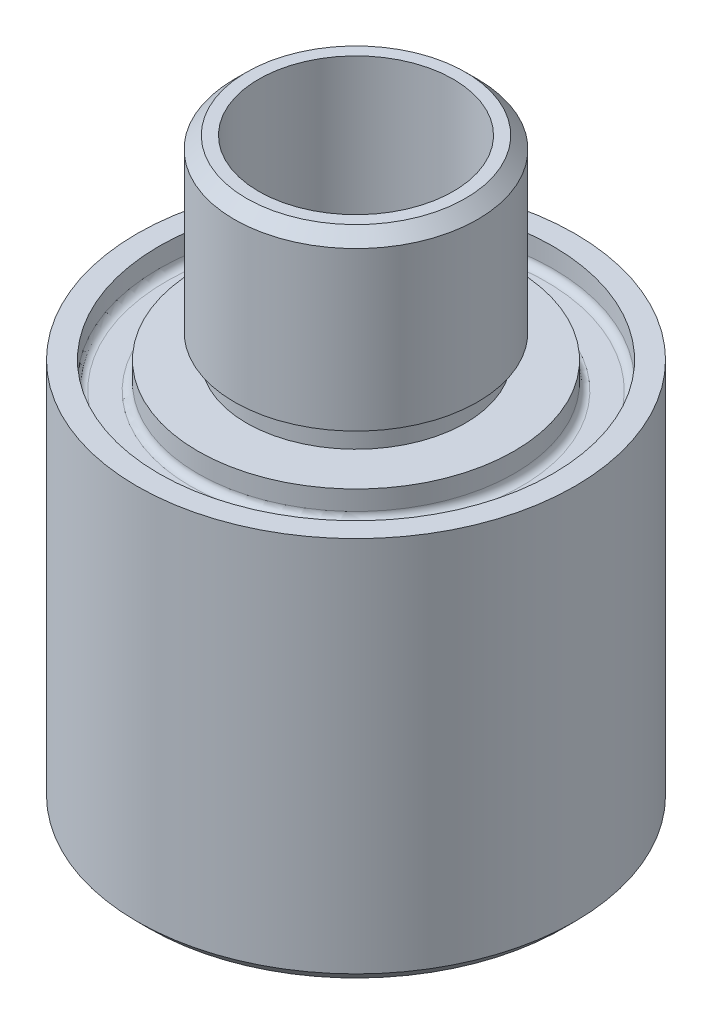
ISO-10303-21;
HEADER;
FILE_DESCRIPTION(('STEP AP214'),'2;1');
FILE_NAME('part.step','',(''),(''),'','','');
FILE_SCHEMA(('AUTOMOTIVE_DESIGN { 1 0 10303 214 1 1 1 1 }'));
ENDSEC;
DATA;
#1=APPLICATION_CONTEXT('core data for automotive mechanical design processes');
#2=APPLICATION_PROTOCOL_DEFINITION('international standard','automotive_design',2000,#1);
#3=PRODUCT_CONTEXT('',#1,'mechanical');
#4=PRODUCT('Part','Part','',(#3));
#5=PRODUCT_RELATED_PRODUCT_CATEGORY('part','',(#4));
#6=PRODUCT_DEFINITION_FORMATION('','',#4);
#7=PRODUCT_DEFINITION_CONTEXT('part definition',#1,'design');
#8=PRODUCT_DEFINITION('design','',#6,#7);
#9=PRODUCT_DEFINITION_SHAPE('','',#8);
#10=(LENGTH_UNIT() NAMED_UNIT(*) SI_UNIT(.MILLI.,.METRE.));
#11=(NAMED_UNIT(*) PLANE_ANGLE_UNIT() SI_UNIT($,.RADIAN.));
#12=(NAMED_UNIT(*) SI_UNIT($,.STERADIAN.) SOLID_ANGLE_UNIT());
#13=UNCERTAINTY_MEASURE_WITH_UNIT(LENGTH_MEASURE(1.E-05),#10,'distance_accuracy_value','');
#14=(GEOMETRIC_REPRESENTATION_CONTEXT(3) GLOBAL_UNCERTAINTY_ASSIGNED_CONTEXT((#13)) GLOBAL_UNIT_ASSIGNED_CONTEXT((#10,
#11,#12)) REPRESENTATION_CONTEXT('',''));
#15=CARTESIAN_POINT('',(0.,0.,0.));
#16=DIRECTION('',(0.,0.,1.));
#17=DIRECTION('',(1.,0.,0.));
#18=AXIS2_PLACEMENT_3D('',#15,#16,#17);
#19=CARTESIAN_POINT('',(0.,16.,0.));
#20=DIRECTION('',(0.,-1.,0.));
#21=DIRECTION('',(0.,0.,-1.));
#22=AXIS2_PLACEMENT_3D('',#19,#20,#21);
#23=CYLINDRICAL_SURFACE('',#22,9.);
#24=CARTESIAN_POINT('',(0.,0.500000000000002,0.));
#25=DIRECTION('',(0.,1.,0.));
#26=DIRECTION('',(0.,0.,1.));
#27=AXIS2_PLACEMENT_3D('',#24,#25,#26);
#28=CIRCLE('',#27,9.);
#29=CARTESIAN_POINT('',(0.,0.500000000000002,9.));
#30=VERTEX_POINT('',#29);
#31=EDGE_CURVE('E49',#30,#30,#28,.T.);
#32=ORIENTED_EDGE('',*,*,#31,.T.);
#33=EDGE_LOOP('',(#32));
#34=FACE_BOUND('',#33,.T.);
#35=CARTESIAN_POINT('',(0.,16.,0.));
#36=DIRECTION('',(0.,1.,0.));
#37=DIRECTION('',(0.,0.,1.));
#38=AXIS2_PLACEMENT_3D('',#35,#36,#37);
#39=CIRCLE('',#38,9.);
#40=CARTESIAN_POINT('',(0.,16.,9.));
#41=VERTEX_POINT('',#40);
#42=EDGE_CURVE('E81',#41,#41,#39,.T.);
#43=ORIENTED_EDGE('',*,*,#42,.F.);
#44=EDGE_LOOP('',(#43));
#45=FACE_BOUND('',#44,.T.);
#46=ADVANCED_FACE('F41',(#34,#45),#23,.T.);
#47=CARTESIAN_POINT('',(0.,16.,0.));
#48=DIRECTION('',(0.,1.,0.));
#49=DIRECTION('',(0.,0.,1.));
#50=AXIS2_PLACEMENT_3D('',#47,#48,#49);
#51=PLANE('',#50);
#52=CARTESIAN_POINT('',(0.,16.,0.));
#53=DIRECTION('',(0.,1.,0.));
#54=DIRECTION('',(0.,0.,1.));
#55=AXIS2_PLACEMENT_3D('',#52,#53,#54);
#56=CIRCLE('',#55,8.1);
#57=CARTESIAN_POINT('',(0.,16.,8.1));
#58=VERTEX_POINT('',#57);
#59=EDGE_CURVE('E98',#58,#58,#56,.T.);
#60=ORIENTED_EDGE('',*,*,#59,.F.);
#61=EDGE_LOOP('',(#60));
#62=FACE_BOUND('',#61,.T.);
#63=ORIENTED_EDGE('',*,*,#42,.T.);
#64=EDGE_LOOP('',(#63));
#65=FACE_BOUND('',#64,.T.);
#66=ADVANCED_FACE('F136',(#62,#65),#51,.T.);
#67=CARTESIAN_POINT('',(0.,0.,0.));
#68=DIRECTION('',(0.,1.,0.));
#69=DIRECTION('',(0.,0.,1.));
#70=AXIS2_PLACEMENT_3D('',#67,#68,#69);
#71=PLANE('',#70);
#72=CARTESIAN_POINT('',(0.,0.,0.));
#73=DIRECTION('',(0.,1.,0.));
#74=DIRECTION('',(0.,0.,1.));
#75=AXIS2_PLACEMENT_3D('',#72,#73,#74);
#76=CIRCLE('',#75,8.49999999999999);
#77=CARTESIAN_POINT('',(0.,0.,8.49999999999999));
#78=VERTEX_POINT('',#77);
#79=EDGE_CURVE('E10',#78,#78,#76,.F.);
#80=ORIENTED_EDGE('',*,*,#79,.T.);
#81=EDGE_LOOP('',(#80));
#82=FACE_BOUND('',#81,.T.);
#83=CARTESIAN_POINT('',(0.,0.,0.));
#84=DIRECTION('',(0.,-1.,0.));
#85=DIRECTION('',(0.,0.,-1.));
#86=AXIS2_PLACEMENT_3D('',#83,#84,#85);
#87=CIRCLE('',#86,7.5);
#88=CARTESIAN_POINT('',(0.,0.,-7.5));
#89=VERTEX_POINT('',#88);
#90=EDGE_CURVE('E85',#89,#89,#87,.T.);
#91=ORIENTED_EDGE('',*,*,#90,.F.);
#92=EDGE_LOOP('',(#91));
#93=FACE_BOUND('',#92,.T.);
#94=ADVANCED_FACE('F146',(#82,#93),#71,.F.);
#95=CARTESIAN_POINT('',(0.,12.5,0.));
#96=DIRECTION('',(0.,-1.,0.));
#97=DIRECTION('',(0.,0.,-1.));
#98=AXIS2_PLACEMENT_3D('',#95,#96,#97);
#99=CYLINDRICAL_SURFACE('',#98,7.5);
#100=CARTESIAN_POINT('',(0.,12.5,0.));
#101=DIRECTION('',(0.,-1.,0.));
#102=DIRECTION('',(0.,0.,-1.));
#103=AXIS2_PLACEMENT_3D('',#100,#101,#102);
#104=CIRCLE('',#103,7.5);
#105=CARTESIAN_POINT('',(0.,12.5,-7.5));
#106=VERTEX_POINT('',#105);
#107=EDGE_CURVE('E84',#106,#106,#104,.T.);
#108=ORIENTED_EDGE('',*,*,#107,.F.);
#109=EDGE_LOOP('',(#108));
#110=FACE_BOUND('',#109,.T.);
#111=ORIENTED_EDGE('',*,*,#90,.T.);
#112=EDGE_LOOP('',(#111));
#113=FACE_BOUND('',#112,.T.);
#114=ADVANCED_FACE('F150',(#110,#113),#99,.F.);
#115=CARTESIAN_POINT('',(0.,12.5,0.));
#116=DIRECTION('',(0.,-1.,0.));
#117=DIRECTION('',(0.,0.,-1.));
#118=AXIS2_PLACEMENT_3D('',#115,#116,#117);
#119=PLANE('',#118);
#120=CARTESIAN_POINT('',(0.,12.5,0.));
#121=DIRECTION('',(0.,-1.,0.));
#122=DIRECTION('',(0.,0.,-1.));
#123=AXIS2_PLACEMENT_3D('',#120,#121,#122);
#124=CIRCLE('',#123,4.5);
#125=CARTESIAN_POINT('',(0.,12.5,-4.5));
#126=VERTEX_POINT('',#125);
#127=EDGE_CURVE('E57',#126,#126,#124,.F.);
#128=ORIENTED_EDGE('',*,*,#127,.T.);
#129=EDGE_LOOP('',(#128));
#130=FACE_BOUND('',#129,.T.);
#131=ORIENTED_EDGE('',*,*,#107,.T.);
#132=EDGE_LOOP('',(#131));
#133=FACE_BOUND('',#132,.T.);
#134=ADVANCED_FACE('F154',(#130,#133),#119,.T.);
#135=CARTESIAN_POINT('',(0.,14.9,0.));
#136=DIRECTION('',(0.,1.,0.));
#137=DIRECTION('',(0.,0.,1.));
#138=AXIS2_PLACEMENT_3D('',#135,#136,#137);
#139=CYLINDRICAL_SURFACE('',#138,8.1);
#140=CARTESIAN_POINT('',(0.,15.2,0.));
#141=DIRECTION('',(0.,1.,0.));
#142=DIRECTION('',(0.,0.,1.));
#143=AXIS2_PLACEMENT_3D('',#140,#141,#142);
#144=CIRCLE('',#143,8.1);
#145=CARTESIAN_POINT('',(0.,15.2,8.1));
#146=VERTEX_POINT('',#145);
#147=EDGE_CURVE('E62',#146,#146,#144,.F.);
#148=ORIENTED_EDGE('',*,*,#147,.T.);
#149=EDGE_LOOP('',(#148));
#150=FACE_BOUND('',#149,.T.);
#151=ORIENTED_EDGE('',*,*,#59,.T.);
#152=EDGE_LOOP('',(#151));
#153=FACE_BOUND('',#152,.T.);
#154=ADVANCED_FACE('F158',(#150,#153),#139,.F.);
#155=CARTESIAN_POINT('',(0.,14.9,0.));
#156=DIRECTION('',(0.,1.,0.));
#157=DIRECTION('',(0.,0.,1.));
#158=AXIS2_PLACEMENT_3D('',#155,#156,#157);
#159=PLANE('',#158);
#160=CARTESIAN_POINT('',(0.,14.9,0.));
#161=DIRECTION('',(0.,1.,0.));
#162=DIRECTION('',(0.,0.,1.));
#163=AXIS2_PLACEMENT_3D('',#160,#161,#162);
#164=CIRCLE('',#163,6.8);
#165=CARTESIAN_POINT('',(0.,14.9,6.8));
#166=VERTEX_POINT('',#165);
#167=EDGE_CURVE('E65',#166,#166,#164,.F.);
#168=ORIENTED_EDGE('',*,*,#167,.T.);
#169=EDGE_LOOP('',(#168));
#170=FACE_BOUND('',#169,.T.);
#171=CARTESIAN_POINT('',(0.,14.9,0.));
#172=DIRECTION('',(0.,1.,0.));
#173=DIRECTION('',(0.,0.,1.));
#174=AXIS2_PLACEMENT_3D('',#171,#172,#173);
#175=CIRCLE('',#174,7.8);
#176=CARTESIAN_POINT('',(0.,14.9,7.8));
#177=VERTEX_POINT('',#176);
#178=EDGE_CURVE('E68',#177,#177,#175,.T.);
#179=ORIENTED_EDGE('',*,*,#178,.T.);
#180=EDGE_LOOP('',(#179));
#181=FACE_BOUND('',#180,.T.);
#182=ADVANCED_FACE('F170',(#170,#181),#159,.T.);
#183=CARTESIAN_POINT('',(0.,14.9,0.));
#184=DIRECTION('',(0.,1.,0.));
#185=DIRECTION('',(0.,0.,1.));
#186=AXIS2_PLACEMENT_3D('',#183,#184,#185);
#187=CYLINDRICAL_SURFACE('',#186,6.5);
#188=CARTESIAN_POINT('',(0.,15.2,0.));
#189=DIRECTION('',(0.,1.,0.));
#190=DIRECTION('',(0.,0.,1.));
#191=AXIS2_PLACEMENT_3D('',#188,#189,#190);
#192=CIRCLE('',#191,6.5);
#193=CARTESIAN_POINT('',(0.,15.2,6.5));
#194=VERTEX_POINT('',#193);
#195=EDGE_CURVE('E71',#194,#194,#192,.T.);
#196=ORIENTED_EDGE('',*,*,#195,.T.);
#197=EDGE_LOOP('',(#196));
#198=FACE_BOUND('',#197,.T.);
#199=CARTESIAN_POINT('',(0.,16.,0.));
#200=DIRECTION('',(0.,1.,0.));
#201=DIRECTION('',(0.,0.,1.));
#202=AXIS2_PLACEMENT_3D('',#199,#200,#201);
#203=CIRCLE('',#202,6.5);
#204=CARTESIAN_POINT('',(0.,16.,6.5));
#205=VERTEX_POINT('',#204);
#206=EDGE_CURVE('E101',#205,#205,#203,.T.);
#207=ORIENTED_EDGE('',*,*,#206,.F.);
#208=EDGE_LOOP('',(#207));
#209=FACE_BOUND('',#208,.T.);
#210=ADVANCED_FACE('F114',(#198,#209),#187,.T.);
#211=CARTESIAN_POINT('',(0.,24.,0.));
#212=DIRECTION('',(0.,1.,0.));
#213=DIRECTION('',(0.,0.,1.));
#214=AXIS2_PLACEMENT_3D('',#211,#212,#213);
#215=PLANE('',#214);
#216=CARTESIAN_POINT('',(0.,24.,0.));
#217=DIRECTION('',(0.,1.,0.));
#218=DIRECTION('',(0.,0.,1.));
#219=AXIS2_PLACEMENT_3D('',#216,#217,#218);
#220=CIRCLE('',#219,4.);
#221=CARTESIAN_POINT('',(0.,24.,4.));
#222=VERTEX_POINT('',#221);
#223=EDGE_CURVE('E104',#222,#222,#220,.T.);
#224=ORIENTED_EDGE('',*,*,#223,.F.);
#225=EDGE_LOOP('',(#224));
#226=FACE_BOUND('',#225,.T.);
#227=CARTESIAN_POINT('',(0.,24.,0.));
#228=DIRECTION('',(0.,1.,0.));
#229=DIRECTION('',(0.,0.,1.));
#230=AXIS2_PLACEMENT_3D('',#227,#228,#229);
#231=CIRCLE('',#230,4.5);
#232=CARTESIAN_POINT('',(0.,24.,4.5));
#233=VERTEX_POINT('',#232);
#234=EDGE_CURVE('E77',#233,#233,#231,.T.);
#235=ORIENTED_EDGE('',*,*,#234,.T.);
#236=EDGE_LOOP('',(#235));
#237=FACE_BOUND('',#236,.T.);
#238=ADVANCED_FACE('F110',(#226,#237),#215,.T.);
#239=CARTESIAN_POINT('',(0.,24.,0.));
#240=DIRECTION('',(0.,-1.,0.));
#241=DIRECTION('',(0.,0.,-1.));
#242=AXIS2_PLACEMENT_3D('',#239,#240,#241);
#243=CYLINDRICAL_SURFACE('',#242,5.);
#244=CARTESIAN_POINT('',(0.,23.5,0.));
#245=DIRECTION('',(0.,1.,0.));
#246=DIRECTION('',(0.,0.,1.));
#247=AXIS2_PLACEMENT_3D('',#244,#245,#246);
#248=CIRCLE('',#247,5.);
#249=CARTESIAN_POINT('',(0.,23.5,5.));
#250=VERTEX_POINT('',#249);
#251=EDGE_CURVE('E74',#250,#250,#248,.F.);
#252=ORIENTED_EDGE('',*,*,#251,.T.);
#253=EDGE_LOOP('',(#252));
#254=FACE_BOUND('',#253,.T.);
#255=CARTESIAN_POINT('',(0.,17.,0.));
#256=DIRECTION('',(0.,1.,0.));
#257=DIRECTION('',(0.,0.,1.));
#258=AXIS2_PLACEMENT_3D('',#255,#256,#257);
#259=CIRCLE('',#258,5.);
#260=CARTESIAN_POINT('',(0.,17.,5.));
#261=VERTEX_POINT('',#260);
#262=EDGE_CURVE('E95',#261,#261,#259,.T.);
#263=ORIENTED_EDGE('',*,*,#262,.T.);
#264=EDGE_LOOP('',(#263));
#265=FACE_BOUND('',#264,.T.);
#266=ADVANCED_FACE('F113',(#254,#265),#243,.T.);
#267=CARTESIAN_POINT('',(0.,17.,0.));
#268=DIRECTION('',(0.,1.,0.));
#269=DIRECTION('',(0.,0.,1.));
#270=AXIS2_PLACEMENT_3D('',#267,#268,#269);
#271=PLANE('',#270);
#272=CARTESIAN_POINT('',(0.,17.,0.));
#273=DIRECTION('',(0.,1.,0.));
#274=DIRECTION('',(0.,0.,1.));
#275=AXIS2_PLACEMENT_3D('',#272,#273,#274);
#276=CIRCLE('',#275,4.5);
#277=CARTESIAN_POINT('',(0.,17.,4.5));
#278=VERTEX_POINT('',#277);
#279=EDGE_CURVE('E88',#278,#278,#276,.T.);
#280=ORIENTED_EDGE('',*,*,#279,.T.);
#281=EDGE_LOOP('',(#280));
#282=FACE_BOUND('',#281,.T.);
#283=ORIENTED_EDGE('',*,*,#262,.F.);
#284=EDGE_LOOP('',(#283));
#285=FACE_BOUND('',#284,.T.);
#286=ADVANCED_FACE('F162',(#282,#285),#271,.F.);
#287=CARTESIAN_POINT('',(0.,17.,0.));
#288=DIRECTION('',(0.,-1.,0.));
#289=DIRECTION('',(0.,0.,-1.));
#290=AXIS2_PLACEMENT_3D('',#287,#288,#289);
#291=CYLINDRICAL_SURFACE('',#290,4.5);
#292=ORIENTED_EDGE('',*,*,#279,.F.);
#293=EDGE_LOOP('',(#292));
#294=FACE_BOUND('',#293,.T.);
#295=CARTESIAN_POINT('',(0.,16.,0.));
#296=DIRECTION('',(0.,1.,0.));
#297=DIRECTION('',(0.,0.,1.));
#298=AXIS2_PLACEMENT_3D('',#295,#296,#297);
#299=CIRCLE('',#298,4.5);
#300=CARTESIAN_POINT('',(0.,16.,4.5));
#301=VERTEX_POINT('',#300);
#302=EDGE_CURVE('E80',#301,#301,#299,.T.);
#303=ORIENTED_EDGE('',*,*,#302,.T.);
#304=EDGE_LOOP('',(#303));
#305=FACE_BOUND('',#304,.T.);
#306=ADVANCED_FACE('F133',(#294,#305),#291,.T.);
#307=ORIENTED_EDGE('',*,*,#302,.F.);
#308=EDGE_LOOP('',(#307));
#309=FACE_BOUND('',#308,.T.);
#310=ORIENTED_EDGE('',*,*,#206,.T.);
#311=EDGE_LOOP('',(#310));
#312=FACE_BOUND('',#311,.T.);
#313=ADVANCED_FACE('F121',(#309,#312),#51,.T.);
#314=CARTESIAN_POINT('',(0.,24.,0.));
#315=DIRECTION('',(0.,-1.,0.));
#316=DIRECTION('',(0.,0.,-1.));
#317=AXIS2_PLACEMENT_3D('',#314,#315,#316);
#318=CONICAL_SURFACE('',#317,4.5,0.785398163397447);
#319=ORIENTED_EDGE('',*,*,#251,.F.);
#320=EDGE_LOOP('',(#319));
#321=FACE_BOUND('',#320,.T.);
#322=ORIENTED_EDGE('',*,*,#234,.F.);
#323=EDGE_LOOP('',(#322));
#324=FACE_BOUND('',#323,.T.);
#325=ADVANCED_FACE('F118',(#321,#324),#318,.T.);
#326=CARTESIAN_POINT('',(0.,15.2,0.));
#327=DIRECTION('',(0.,1.,0.));
#328=DIRECTION('',(0.,0.,1.));
#329=AXIS2_PLACEMENT_3D('',#326,#327,#328);
#330=TOROIDAL_SURFACE('',#329,6.8,0.3);
#331=ORIENTED_EDGE('',*,*,#167,.F.);
#332=EDGE_LOOP('',(#331));
#333=FACE_BOUND('',#332,.T.);
#334=ORIENTED_EDGE('',*,*,#195,.F.);
#335=EDGE_LOOP('',(#334));
#336=FACE_BOUND('',#335,.T.);
#337=ADVANCED_FACE('F120',(#333,#336),#330,.F.);
#338=CARTESIAN_POINT('',(0.,15.2,0.));
#339=DIRECTION('',(0.,1.,0.));
#340=DIRECTION('',(0.,0.,1.));
#341=AXIS2_PLACEMENT_3D('',#338,#339,#340);
#342=TOROIDAL_SURFACE('',#341,7.8,0.3);
#343=ORIENTED_EDGE('',*,*,#147,.F.);
#344=EDGE_LOOP('',(#343));
#345=FACE_BOUND('',#344,.T.);
#346=ORIENTED_EDGE('',*,*,#178,.F.);
#347=EDGE_LOOP('',(#346));
#348=FACE_BOUND('',#347,.T.);
#349=ADVANCED_FACE('F129',(#345,#348),#342,.F.);
#350=CARTESIAN_POINT('',(0.,12.5,0.));
#351=DIRECTION('',(0.,1.,0.));
#352=DIRECTION('',(0.,0.,1.));
#353=AXIS2_PLACEMENT_3D('',#350,#351,#352);
#354=CYLINDRICAL_SURFACE('',#353,4.);
#355=CARTESIAN_POINT('',(0.,13.,0.));
#356=DIRECTION('',(0.,-1.,0.));
#357=DIRECTION('',(0.,0.,-1.));
#358=AXIS2_PLACEMENT_3D('',#355,#356,#357);
#359=CIRCLE('',#358,4.);
#360=CARTESIAN_POINT('',(0.,13.,-4.));
#361=VERTEX_POINT('',#360);
#362=EDGE_CURVE('E53',#361,#361,#359,.T.);
#363=ORIENTED_EDGE('',*,*,#362,.T.);
#364=EDGE_LOOP('',(#363));
#365=FACE_BOUND('',#364,.T.);
#366=ORIENTED_EDGE('',*,*,#223,.T.);
#367=EDGE_LOOP('',(#366));
#368=FACE_BOUND('',#367,.T.);
#369=ADVANCED_FACE('F108',(#365,#368),#354,.F.);
#370=CARTESIAN_POINT('',(0.,12.5,0.));
#371=DIRECTION('',(0.,-1.,0.));
#372=DIRECTION('',(0.,0.,-1.));
#373=AXIS2_PLACEMENT_3D('',#370,#371,#372);
#374=CONICAL_SURFACE('',#373,4.5,0.785398163397448);
#375=ORIENTED_EDGE('',*,*,#362,.F.);
#376=EDGE_LOOP('',(#375));
#377=FACE_BOUND('',#376,.T.);
#378=ORIENTED_EDGE('',*,*,#127,.F.);
#379=EDGE_LOOP('',(#378));
#380=FACE_BOUND('',#379,.T.);
#381=ADVANCED_FACE('F179',(#377,#380),#374,.F.);
#382=CARTESIAN_POINT('',(0.,0.500000000000002,0.));
#383=DIRECTION('',(0.,1.,0.));
#384=DIRECTION('',(0.,0.,1.));
#385=AXIS2_PLACEMENT_3D('',#382,#383,#384);
#386=CONICAL_SURFACE('',#385,9.,0.785398163397452);
#387=ORIENTED_EDGE('',*,*,#79,.F.);
#388=EDGE_LOOP('',(#387));
#389=FACE_BOUND('',#388,.T.);
#390=ORIENTED_EDGE('',*,*,#31,.F.);
#391=EDGE_LOOP('',(#390));
#392=FACE_BOUND('',#391,.T.);
#393=ADVANCED_FACE('F44',(#389,#392),#386,.T.);
#394=CLOSED_SHELL('',(#46,#66,#94,#114,#134,#154,#182,#210,#238,#266,#286,#306,#313,#325,#337,
#349,#369,#381,#393));
#395=MANIFOLD_SOLID_BREP('B2',#394);
#396=ADVANCED_BREP_SHAPE_REPRESENTATION('',(#18,#395),#14);
#397=SHAPE_DEFINITION_REPRESENTATION(#9,#396);
ENDSEC;
END-ISO-10303-21;
